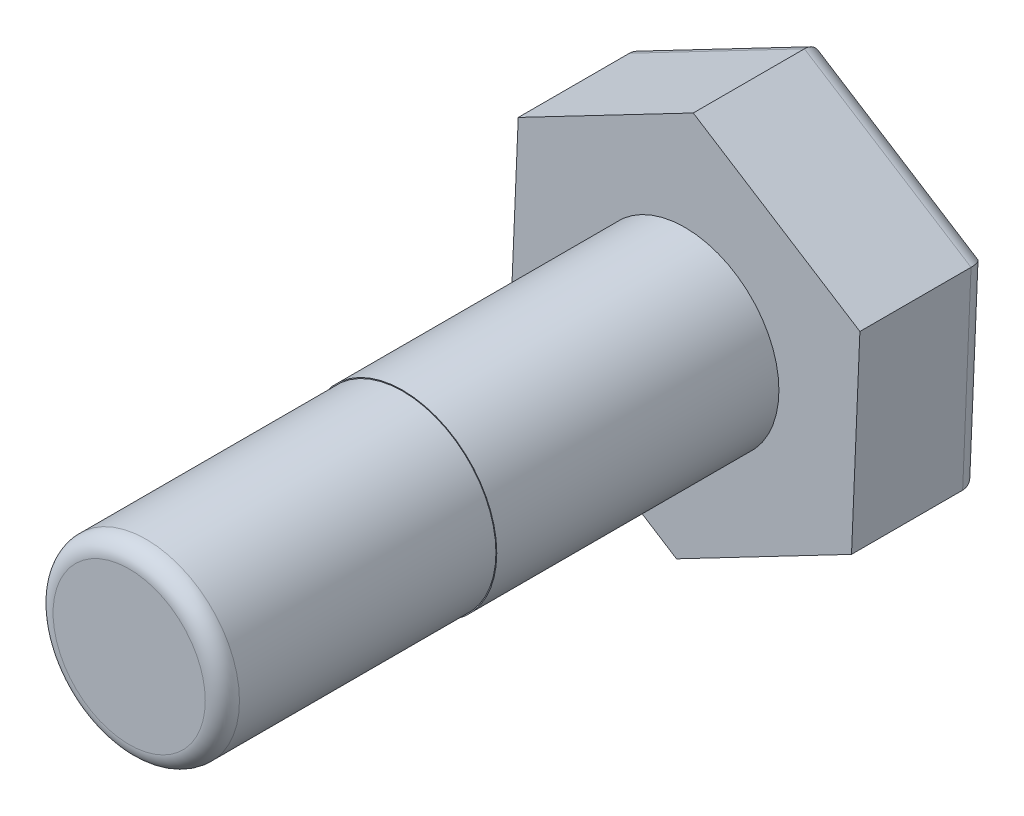
ISO-10303-21;
HEADER;
FILE_DESCRIPTION(('STEP AP214'),'2;1');
FILE_NAME('part.step','',(''),(''),'','','');
FILE_SCHEMA(('AUTOMOTIVE_DESIGN { 1 0 10303 214 1 1 1 1 }'));
ENDSEC;
DATA;
#1=APPLICATION_CONTEXT('core data for automotive mechanical design processes');
#2=APPLICATION_PROTOCOL_DEFINITION('international standard','automotive_design',2000,#1);
#3=PRODUCT_CONTEXT('',#1,'mechanical');
#4=PRODUCT('Part','Part','',(#3));
#5=PRODUCT_RELATED_PRODUCT_CATEGORY('part','',(#4));
#6=PRODUCT_DEFINITION_FORMATION('','',#4);
#7=PRODUCT_DEFINITION_CONTEXT('part definition',#1,'design');
#8=PRODUCT_DEFINITION('design','',#6,#7);
#9=PRODUCT_DEFINITION_SHAPE('','',#8);
#10=(LENGTH_UNIT() NAMED_UNIT(*) SI_UNIT(.MILLI.,.METRE.));
#11=(NAMED_UNIT(*) PLANE_ANGLE_UNIT() SI_UNIT($,.RADIAN.));
#12=(NAMED_UNIT(*) SI_UNIT($,.STERADIAN.) SOLID_ANGLE_UNIT());
#13=UNCERTAINTY_MEASURE_WITH_UNIT(LENGTH_MEASURE(1.E-05),#10,'distance_accuracy_value','');
#14=(GEOMETRIC_REPRESENTATION_CONTEXT(3) GLOBAL_UNCERTAINTY_ASSIGNED_CONTEXT((#13)) GLOBAL_UNIT_ASSIGNED_CONTEXT((#10,
#11,#12)) REPRESENTATION_CONTEXT('',''));
#15=CARTESIAN_POINT('',(0.,0.,0.));
#16=DIRECTION('',(0.,0.,1.));
#17=DIRECTION('',(1.,0.,0.));
#18=AXIS2_PLACEMENT_3D('',#15,#16,#17);
#19=CARTESIAN_POINT('',(0.,0.,48.));
#20=DIRECTION('',(0.,0.,1.));
#21=DIRECTION('',(1.,0.,0.));
#22=AXIS2_PLACEMENT_3D('',#19,#20,#21);
#23=PLANE('',#22);
#24=CARTESIAN_POINT('',(0.,0.,48.));
#25=DIRECTION('',(0.,0.,1.));
#26=DIRECTION('',(1.,0.,0.));
#27=AXIS2_PLACEMENT_3D('',#24,#25,#26);
#28=CIRCLE('',#27,11.);
#29=CARTESIAN_POINT('',(11.,0.,48.));
#30=VERTEX_POINT('',#29);
#31=EDGE_CURVE('E130',#30,#30,#28,.T.);
#32=ORIENTED_EDGE('',*,*,#31,.T.);
#33=EDGE_LOOP('',(#32));
#34=FACE_BOUND('',#33,.T.);
#35=CARTESIAN_POINT('',(0.,0.,48.));
#36=DIRECTION('',(0.,0.,1.));
#37=DIRECTION('',(1.,0.,0.));
#38=AXIS2_PLACEMENT_3D('',#35,#36,#37);
#39=CIRCLE('',#38,10.9);
#40=CARTESIAN_POINT('',(10.9,0.,48.));
#41=VERTEX_POINT('',#40);
#42=EDGE_CURVE('E165',#41,#41,#39,.T.);
#43=ORIENTED_EDGE('',*,*,#42,.F.);
#44=EDGE_LOOP('',(#43));
#45=FACE_BOUND('',#44,.T.);
#46=ADVANCED_FACE('F36',(#34,#45),#23,.T.);
#47=CARTESIAN_POINT('',(21.4532721099387,33.7602890357432,15.));
#48=DIRECTION('',(0.,0.,1.));
#49=DIRECTION('',(1.,0.,0.));
#50=AXIS2_PLACEMENT_3D('',#47,#48,#49);
#51=PLANE('',#50);
#52=DIRECTION('',(0.0424733530908878,0.999097599975707,0.));
#53=VECTOR('',#52,1.);
#54=CARTESIAN_POINT('',(19.4915119627059,-12.3860524276714,15.));
#55=LINE('',#54,#53);
#56=CARTESIAN_POINT('',(19.4915119627059,-12.3860524276714,15.));
#57=VERTEX_POINT('',#56);
#58=CARTESIAN_POINT('',(20.4723920363223,10.6871183040359,15.));
#59=VERTEX_POINT('',#58);
#60=EDGE_CURVE('E122',#57,#59,#55,.T.);
#61=ORIENTED_EDGE('',*,*,#60,.T.);
#62=DIRECTION('',(-0.844007225893581,0.536331802748468,0.));
#63=VECTOR('',#62,1.);
#64=CARTESIAN_POINT('',(20.4723920363223,10.6871183040359,15.));
#65=LINE('',#64,#63);
#66=CARTESIAN_POINT('',(0.980880073616411,23.0731707317073,15.));
#67=VERTEX_POINT('',#66);
#68=EDGE_CURVE('E110',#59,#67,#65,.T.);
#69=ORIENTED_EDGE('',*,*,#68,.T.);
#70=DIRECTION('',(-0.886480578984469,-0.462765797227238,0.));
#71=VECTOR('',#70,1.);
#72=CARTESIAN_POINT('',(0.980880073616411,23.0731707317073,15.));
#73=LINE('',#72,#71);
#74=CARTESIAN_POINT('',(-19.4915119627059,12.3860524276714,15.));
#75=VERTEX_POINT('',#74);
#76=EDGE_CURVE('E121',#67,#75,#73,.T.);
#77=ORIENTED_EDGE('',*,*,#76,.T.);
#78=DIRECTION('',(-0.0424733530908877,-0.999097599975707,0.));
#79=VECTOR('',#78,1.);
#80=CARTESIAN_POINT('',(-19.4915119627059,12.3860524276714,15.));
#81=LINE('',#80,#79);
#82=CARTESIAN_POINT('',(-20.4723920363223,-10.6871183040359,15.));
#83=VERTEX_POINT('',#82);
#84=EDGE_CURVE('E270',#75,#83,#81,.T.);
#85=ORIENTED_EDGE('',*,*,#84,.T.);
#86=DIRECTION('',(0.844007225893581,-0.536331802748469,0.));
#87=VECTOR('',#86,1.);
#88=CARTESIAN_POINT('',(-20.4723920363223,-10.6871183040359,15.));
#89=LINE('',#88,#87);
#90=CARTESIAN_POINT('',(-0.980880073616402,-23.0731707317073,15.));
#91=VERTEX_POINT('',#90);
#92=EDGE_CURVE('E272',#83,#91,#89,.T.);
#93=ORIENTED_EDGE('',*,*,#92,.T.);
#94=DIRECTION('',(0.886480578984469,0.462765797227238,0.));
#95=VECTOR('',#94,1.);
#96=CARTESIAN_POINT('',(-0.980880073616402,-23.0731707317073,15.));
#97=LINE('',#96,#95);
#98=EDGE_CURVE('E128',#91,#57,#97,.T.);
#99=ORIENTED_EDGE('',*,*,#98,.T.);
#100=EDGE_LOOP('',(#61,#69,#77,#85,#93,#99));
#101=FACE_BOUND('',#100,.T.);
#102=CARTESIAN_POINT('',(0.,0.,15.));
#103=DIRECTION('',(0.,0.,1.));
#104=DIRECTION('',(1.,0.,0.));
#105=AXIS2_PLACEMENT_3D('',#102,#103,#104);
#106=CIRCLE('',#105,11.);
#107=CARTESIAN_POINT('',(11.,0.,15.));
#108=VERTEX_POINT('',#107);
#109=EDGE_CURVE('E178',#108,#108,#106,.T.);
#110=ORIENTED_EDGE('',*,*,#109,.F.);
#111=EDGE_LOOP('',(#110));
#112=FACE_BOUND('',#111,.T.);
#113=ADVANCED_FACE('F125',(#101,#112),#51,.T.);
#114=CARTESIAN_POINT('',(19.4915119627059,-12.3860524276714,15.));
#115=DIRECTION('',(-0.999097599975706,0.0424733530908878,0.));
#116=DIRECTION('',(-0.0424733530908878,-0.999097599975706,0.));
#117=AXIS2_PLACEMENT_3D('',#114,#115,#116);
#118=PLANE('',#117);
#119=DIRECTION('',(0.,0.,-1.));
#120=VECTOR('',#119,1.);
#121=CARTESIAN_POINT('',(19.4915119627059,-12.3860524276714,15.));
#122=LINE('',#121,#120);
#123=CARTESIAN_POINT('',(19.4915119627059,-12.3860524276714,2.));
#124=VERTEX_POINT('',#123);
#125=EDGE_CURVE('E277',#57,#124,#122,.T.);
#126=ORIENTED_EDGE('',*,*,#125,.T.);
#127=DIRECTION('',(0.0424733530908878,0.999097599975706,0.));
#128=VECTOR('',#127,1.);
#129=CARTESIAN_POINT('',(19.4915119627059,-12.3860524276714,2.));
#130=LINE('',#129,#128);
#131=CARTESIAN_POINT('',(20.4723920363223,10.6871183040359,2.));
#132=VERTEX_POINT('',#131);
#133=EDGE_CURVE('E134',#124,#132,#130,.T.);
#134=ORIENTED_EDGE('',*,*,#133,.T.);
#135=DIRECTION('',(0.,0.,-1.));
#136=VECTOR('',#135,1.);
#137=CARTESIAN_POINT('',(20.4723920363223,10.6871183040359,15.));
#138=LINE('',#137,#136);
#139=EDGE_CURVE('E115',#59,#132,#138,.T.);
#140=ORIENTED_EDGE('',*,*,#139,.F.);
#141=ORIENTED_EDGE('',*,*,#60,.F.);
#142=EDGE_LOOP('',(#126,#134,#140,#141));
#143=FACE_BOUND('',#142,.T.);
#144=ADVANCED_FACE('F132',(#143),#118,.F.);
#145=CARTESIAN_POINT('',(20.4723920363223,10.6871183040359,15.));
#146=DIRECTION('',(-0.536331802748468,-0.844007225893581,0.));
#147=DIRECTION('',(0.844007225893581,-0.536331802748468,0.));
#148=AXIS2_PLACEMENT_3D('',#145,#146,#147);
#149=PLANE('',#148);
#150=ORIENTED_EDGE('',*,*,#139,.T.);
#151=DIRECTION('',(-0.844007225893581,0.536331802748468,0.));
#152=VECTOR('',#151,1.);
#153=CARTESIAN_POINT('',(20.4723920363223,10.6871183040359,2.));
#154=LINE('',#153,#152);
#155=CARTESIAN_POINT('',(0.980880073616411,23.0731707317073,2.));
#156=VERTEX_POINT('',#155);
#157=EDGE_CURVE('E135',#132,#156,#154,.T.);
#158=ORIENTED_EDGE('',*,*,#157,.T.);
#159=DIRECTION('',(0.,0.,-1.));
#160=VECTOR('',#159,1.);
#161=CARTESIAN_POINT('',(0.980880073616411,23.0731707317073,15.));
#162=LINE('',#161,#160);
#163=EDGE_CURVE('E118',#67,#156,#162,.T.);
#164=ORIENTED_EDGE('',*,*,#163,.F.);
#165=ORIENTED_EDGE('',*,*,#68,.F.);
#166=EDGE_LOOP('',(#150,#158,#164,#165));
#167=FACE_BOUND('',#166,.T.);
#168=ADVANCED_FACE('F112',(#167),#149,.F.);
#169=CARTESIAN_POINT('',(0.980880073616411,23.0731707317073,15.));
#170=DIRECTION('',(0.462765797227238,-0.886480578984469,0.));
#171=DIRECTION('',(0.886480578984469,0.462765797227238,0.));
#172=AXIS2_PLACEMENT_3D('',#169,#170,#171);
#173=PLANE('',#172);
#174=ORIENTED_EDGE('',*,*,#163,.T.);
#175=DIRECTION('',(-0.886480578984469,-0.462765797227238,0.));
#176=VECTOR('',#175,1.);
#177=CARTESIAN_POINT('',(0.980880073616411,23.0731707317073,2.));
#178=LINE('',#177,#176);
#179=CARTESIAN_POINT('',(-19.4915119627059,12.3860524276714,2.));
#180=VERTEX_POINT('',#179);
#181=EDGE_CURVE('E155',#156,#180,#178,.T.);
#182=ORIENTED_EDGE('',*,*,#181,.T.);
#183=DIRECTION('',(0.,0.,-1.));
#184=VECTOR('',#183,1.);
#185=CARTESIAN_POINT('',(-19.4915119627059,12.3860524276714,15.));
#186=LINE('',#185,#184);
#187=EDGE_CURVE('E139',#75,#180,#186,.T.);
#188=ORIENTED_EDGE('',*,*,#187,.F.);
#189=ORIENTED_EDGE('',*,*,#76,.F.);
#190=EDGE_LOOP('',(#174,#182,#188,#189));
#191=FACE_BOUND('',#190,.T.);
#192=ADVANCED_FACE('F221',(#191),#173,.F.);
#193=CARTESIAN_POINT('',(-19.4915119627059,12.3860524276714,15.));
#194=DIRECTION('',(0.999097599975706,-0.0424733530908877,0.));
#195=DIRECTION('',(0.0424733530908877,0.999097599975706,0.));
#196=AXIS2_PLACEMENT_3D('',#193,#194,#195);
#197=PLANE('',#196);
#198=ORIENTED_EDGE('',*,*,#187,.T.);
#199=DIRECTION('',(-0.0424733530908877,-0.999097599975706,0.));
#200=VECTOR('',#199,1.);
#201=CARTESIAN_POINT('',(-19.4915119627059,12.3860524276714,2.));
#202=LINE('',#201,#200);
#203=CARTESIAN_POINT('',(-20.4723920363223,-10.6871183040359,2.));
#204=VERTEX_POINT('',#203);
#205=EDGE_CURVE('E157',#180,#204,#202,.T.);
#206=ORIENTED_EDGE('',*,*,#205,.T.);
#207=DIRECTION('',(0.,0.,-1.));
#208=VECTOR('',#207,1.);
#209=CARTESIAN_POINT('',(-20.4723920363223,-10.6871183040359,15.));
#210=LINE('',#209,#208);
#211=EDGE_CURVE('E281',#83,#204,#210,.T.);
#212=ORIENTED_EDGE('',*,*,#211,.F.);
#213=ORIENTED_EDGE('',*,*,#84,.F.);
#214=EDGE_LOOP('',(#198,#206,#212,#213));
#215=FACE_BOUND('',#214,.T.);
#216=ADVANCED_FACE('F218',(#215),#197,.F.);
#217=CARTESIAN_POINT('',(-20.4723920363223,-10.6871183040359,15.));
#218=DIRECTION('',(0.536331802748468,0.844007225893581,0.));
#219=DIRECTION('',(-0.844007225893581,0.536331802748468,0.));
#220=AXIS2_PLACEMENT_3D('',#217,#218,#219);
#221=PLANE('',#220);
#222=ORIENTED_EDGE('',*,*,#211,.T.);
#223=DIRECTION('',(0.844007225893581,-0.536331802748468,0.));
#224=VECTOR('',#223,1.);
#225=CARTESIAN_POINT('',(-20.4723920363223,-10.6871183040359,2.));
#226=LINE('',#225,#224);
#227=CARTESIAN_POINT('',(-0.980880073616402,-23.0731707317073,2.));
#228=VERTEX_POINT('',#227);
#229=EDGE_CURVE('E59',#204,#228,#226,.T.);
#230=ORIENTED_EDGE('',*,*,#229,.T.);
#231=DIRECTION('',(0.,0.,-1.));
#232=VECTOR('',#231,1.);
#233=CARTESIAN_POINT('',(-0.980880073616402,-23.0731707317073,15.));
#234=LINE('',#233,#232);
#235=EDGE_CURVE('E279',#91,#228,#234,.T.);
#236=ORIENTED_EDGE('',*,*,#235,.F.);
#237=ORIENTED_EDGE('',*,*,#92,.F.);
#238=EDGE_LOOP('',(#222,#230,#236,#237));
#239=FACE_BOUND('',#238,.T.);
#240=ADVANCED_FACE('F215',(#239),#221,.F.);
#241=CARTESIAN_POINT('',(-0.980880073616402,-23.0731707317073,15.));
#242=DIRECTION('',(-0.462765797227238,0.886480578984469,0.));
#243=DIRECTION('',(-0.886480578984469,-0.462765797227238,0.));
#244=AXIS2_PLACEMENT_3D('',#241,#242,#243);
#245=PLANE('',#244);
#246=ORIENTED_EDGE('',*,*,#235,.T.);
#247=DIRECTION('',(0.886480578984469,0.462765797227238,0.));
#248=VECTOR('',#247,1.);
#249=CARTESIAN_POINT('',(-0.980880073616402,-23.0731707317073,2.));
#250=LINE('',#249,#248);
#251=EDGE_CURVE('E51',#228,#124,#250,.T.);
#252=ORIENTED_EDGE('',*,*,#251,.T.);
#253=ORIENTED_EDGE('',*,*,#125,.F.);
#254=ORIENTED_EDGE('',*,*,#98,.F.);
#255=EDGE_LOOP('',(#246,#252,#253,#254));
#256=FACE_BOUND('',#255,.T.);
#257=ADVANCED_FACE('F211',(#256),#245,.F.);
#258=CARTESIAN_POINT('',(21.4532721099387,33.7602890357432,0.));
#259=DIRECTION('',(0.,0.,1.));
#260=DIRECTION('',(1.,0.,0.));
#261=AXIS2_PLACEMENT_3D('',#258,#259,#260);
#262=PLANE('',#261);
#263=DIRECTION('',(-0.886480578984469,-0.462765797227238,0.));
#264=VECTOR('',#263,1.);
#265=CARTESIAN_POINT('',(22.3788037043932,31.9873278777743,0.));
#266=LINE('',#265,#264);
#267=CARTESIAN_POINT('',(-17.5423607664353,11.1474471849043,0.));
#268=VERTEX_POINT('',#267);
#269=CARTESIAN_POINT('',(0.882792066254768,20.7658536585366,0.));
#270=VERTEX_POINT('',#269);
#271=EDGE_CURVE('E150',#268,#270,#266,.F.);
#272=ORIENTED_EDGE('',*,*,#271,.T.);
#273=DIRECTION('',(-0.844007225893581,0.536331802748468,0.));
#274=VECTOR('',#273,1.);
#275=CARTESIAN_POINT('',(9.65397244947244,15.1921300660844,0.));
#276=LINE('',#275,#274);
#277=CARTESIAN_POINT('',(18.4251528326901,9.61840647363232,0.));
#278=VERTEX_POINT('',#277);
#279=EDGE_CURVE('E152',#270,#278,#276,.F.);
#280=ORIENTED_EDGE('',*,*,#279,.T.);
#281=DIRECTION('',(0.0424733530908878,0.999097599975706,0.));
#282=VECTOR('',#281,1.);
#283=CARTESIAN_POINT('',(19.4550769099873,33.845235741925,0.));
#284=LINE('',#283,#282);
#285=CARTESIAN_POINT('',(17.5423607664353,-11.1474471849043,0.));
#286=VERTEX_POINT('',#285);
#287=EDGE_CURVE('E137',#278,#286,#284,.F.);
#288=ORIENTED_EDGE('',*,*,#287,.T.);
#289=DIRECTION('',(0.886480578984469,0.462765797227238,0.));
#290=VECTOR('',#289,1.);
#291=CARTESIAN_POINT('',(39.0383724045738,0.0740270343334015,0.));
#292=LINE('',#291,#290);
#293=CARTESIAN_POINT('',(-0.882792066254761,-20.7658536585366,0.));
#294=VERTEX_POINT('',#293);
#295=EDGE_CURVE('E144',#286,#294,#292,.F.);
#296=ORIENTED_EDGE('',*,*,#295,.T.);
#297=DIRECTION('',(0.844007225893581,-0.536331802748468,0.));
#298=VECTOR('',#297,1.);
#299=CARTESIAN_POINT('',(-9.65397244947243,-15.1921300660844,0.));
#300=LINE('',#299,#298);
#301=CARTESIAN_POINT('',(-18.4251528326901,-9.61840647363232,0.));
#302=VERTEX_POINT('',#301);
#303=EDGE_CURVE('E146',#294,#302,#300,.F.);
#304=ORIENTED_EDGE('',*,*,#303,.T.);
#305=DIRECTION('',(-0.0424733530908877,-0.999097599975706,0.));
#306=VECTOR('',#305,1.);
#307=CARTESIAN_POINT('',(-16.5124366891381,35.374276453197,0.));
#308=LINE('',#307,#306);
#309=EDGE_CURVE('E148',#302,#268,#308,.F.);
#310=ORIENTED_EDGE('',*,*,#309,.T.);
#311=EDGE_LOOP('',(#272,#280,#288,#296,#304,#310));
#312=FACE_BOUND('',#311,.T.);
#313=ADVANCED_FACE('F206',(#312),#262,.F.);
#314=CARTESIAN_POINT('',(0.,0.,48.));
#315=DIRECTION('',(0.,0.,-1.));
#316=DIRECTION('',(-1.,0.,0.));
#317=AXIS2_PLACEMENT_3D('',#314,#315,#316);
#318=CYLINDRICAL_SURFACE('',#317,11.);
#319=ORIENTED_EDGE('',*,*,#31,.F.);
#320=EDGE_LOOP('',(#319));
#321=FACE_BOUND('',#320,.T.);
#322=ORIENTED_EDGE('',*,*,#109,.T.);
#323=EDGE_LOOP('',(#322));
#324=FACE_BOUND('',#323,.T.);
#325=ADVANCED_FACE('F203',(#321,#324),#318,.T.);
#326=CARTESIAN_POINT('',(-19.3997284308254,-8.99910385224874,2.));
#327=DIRECTION('',(0.844007225893581,-0.536331802748468,0.));
#328=DIRECTION('',(0.536331802748468,0.844007225893581,0.));
#329=AXIS2_PLACEMENT_3D('',#326,#327,#328);
#330=CYLINDRICAL_SURFACE('',#329,2.);
#331=CARTESIAN_POINT('',(-18.4251528326901,-9.61840647363232,2.));
#332=DIRECTION('',(0.462765797227238,-0.886480578984469,0.));
#333=DIRECTION('',(0.886480578984469,0.462765797227238,0.));
#334=AXIS2_PLACEMENT_3D('',#331,#332,#333);
#335=ELLIPSE('',#334,2.3094010767585,2.);
#336=EDGE_CURVE('E173',#302,#204,#335,.F.);
#337=ORIENTED_EDGE('',*,*,#336,.F.);
#338=ORIENTED_EDGE('',*,*,#303,.F.);
#339=CARTESIAN_POINT('',(-0.882792066254761,-20.7658536585366,2.));
#340=DIRECTION('',(0.999097599975706,-0.042473353090888,0.));
#341=DIRECTION('',(0.042473353090888,0.999097599975707,0.));
#342=AXIS2_PLACEMENT_3D('',#339,#340,#341);
#343=ELLIPSE('',#342,2.3094010767585,2.);
#344=EDGE_CURVE('E176',#228,#294,#343,.T.);
#345=ORIENTED_EDGE('',*,*,#344,.F.);
#346=ORIENTED_EDGE('',*,*,#229,.F.);
#347=EDGE_LOOP('',(#337,#338,#345,#346));
#348=FACE_BOUND('',#347,.T.);
#349=ADVANCED_FACE('F205',(#348),#330,.T.);
#350=CARTESIAN_POINT('',(-1.90641166807088,-21.3002095737384,2.));
#351=DIRECTION('',(0.886480578984469,0.462765797227238,0.));
#352=DIRECTION('',(-0.462765797227238,0.886480578984469,0.));
#353=AXIS2_PLACEMENT_3D('',#350,#351,#352);
#354=CYLINDRICAL_SURFACE('',#353,2.);
#355=ORIENTED_EDGE('',*,*,#344,.T.);
#356=ORIENTED_EDGE('',*,*,#295,.F.);
#357=CARTESIAN_POINT('',(17.5423607664353,-11.1474471849043,2.));
#358=DIRECTION('',(0.536331802748468,0.844007225893581,0.));
#359=DIRECTION('',(-0.844007225893581,0.536331802748469,0.));
#360=AXIS2_PLACEMENT_3D('',#357,#358,#359);
#361=ELLIPSE('',#360,2.3094010767585,2.);
#362=EDGE_CURVE('E170',#124,#286,#361,.T.);
#363=ORIENTED_EDGE('',*,*,#362,.F.);
#364=ORIENTED_EDGE('',*,*,#251,.F.);
#365=EDGE_LOOP('',(#355,#356,#363,#364));
#366=FACE_BOUND('',#365,.T.);
#367=ADVANCED_FACE('F245',(#366),#354,.T.);
#368=CARTESIAN_POINT('',(-17.4933167627545,12.3011057214896,2.));
#369=DIRECTION('',(-0.0424733530908877,-0.999097599975706,0.));
#370=DIRECTION('',(0.999097599975706,-0.0424733530908877,0.));
#371=AXIS2_PLACEMENT_3D('',#368,#369,#370);
#372=CYLINDRICAL_SURFACE('',#371,2.);
#373=ORIENTED_EDGE('',*,*,#336,.T.);
#374=ORIENTED_EDGE('',*,*,#205,.F.);
#375=CARTESIAN_POINT('',(-17.5423607664353,11.1474471849043,2.));
#376=DIRECTION('',(-0.536331802748468,-0.844007225893581,0.));
#377=DIRECTION('',(0.844007225893581,-0.536331802748468,0.));
#378=AXIS2_PLACEMENT_3D('',#375,#376,#377);
#379=ELLIPSE('',#378,2.3094010767585,2.);
#380=EDGE_CURVE('E167',#268,#180,#379,.F.);
#381=ORIENTED_EDGE('',*,*,#380,.F.);
#382=ORIENTED_EDGE('',*,*,#309,.F.);
#383=EDGE_LOOP('',(#373,#374,#381,#382));
#384=FACE_BOUND('',#383,.T.);
#385=ADVANCED_FACE('F241',(#384),#372,.T.);
#386=CARTESIAN_POINT('',(17.4933167627545,-12.3011057214897,2.));
#387=DIRECTION('',(0.0424733530908878,0.999097599975706,0.));
#388=DIRECTION('',(-0.999097599975706,0.0424733530908878,0.));
#389=AXIS2_PLACEMENT_3D('',#386,#387,#388);
#390=CYLINDRICAL_SURFACE('',#389,2.);
#391=ORIENTED_EDGE('',*,*,#362,.T.);
#392=ORIENTED_EDGE('',*,*,#287,.F.);
#393=CARTESIAN_POINT('',(18.4251528326901,9.61840647363231,2.));
#394=DIRECTION('',(-0.462765797227238,0.886480578984469,0.));
#395=DIRECTION('',(0.886480578984469,0.462765797227238,0.));
#396=AXIS2_PLACEMENT_3D('',#393,#394,#395);
#397=ELLIPSE('',#396,2.3094010767585,2.);
#398=EDGE_CURVE('E164',#132,#278,#397,.T.);
#399=ORIENTED_EDGE('',*,*,#398,.F.);
#400=ORIENTED_EDGE('',*,*,#133,.F.);
#401=EDGE_LOOP('',(#391,#392,#399,#400));
#402=FACE_BOUND('',#401,.T.);
#403=ADVANCED_FACE('F237',(#402),#390,.T.);
#404=CARTESIAN_POINT('',(1.90641166807089,21.3002095737384,2.));
#405=DIRECTION('',(-0.886480578984469,-0.462765797227238,0.));
#406=DIRECTION('',(0.462765797227238,-0.886480578984469,0.));
#407=AXIS2_PLACEMENT_3D('',#404,#405,#406);
#408=CYLINDRICAL_SURFACE('',#407,2.);
#409=ORIENTED_EDGE('',*,*,#380,.T.);
#410=ORIENTED_EDGE('',*,*,#181,.F.);
#411=CARTESIAN_POINT('',(0.882792066254761,20.7658536585366,2.));
#412=DIRECTION('',(-0.999097599975706,0.042473353090888,0.));
#413=DIRECTION('',(-0.0424733530908879,-0.999097599975706,0.));
#414=AXIS2_PLACEMENT_3D('',#411,#412,#413);
#415=ELLIPSE('',#414,2.3094010767585,2.);
#416=EDGE_CURVE('E162',#270,#156,#415,.F.);
#417=ORIENTED_EDGE('',*,*,#416,.F.);
#418=ORIENTED_EDGE('',*,*,#271,.F.);
#419=EDGE_LOOP('',(#409,#410,#417,#418));
#420=FACE_BOUND('',#419,.T.);
#421=ADVANCED_FACE('F233',(#420),#408,.T.);
#422=CARTESIAN_POINT('',(19.3997284308254,8.99910385224875,2.));
#423=DIRECTION('',(-0.844007225893581,0.536331802748468,0.));
#424=DIRECTION('',(-0.536331802748468,-0.844007225893581,0.));
#425=AXIS2_PLACEMENT_3D('',#422,#423,#424);
#426=CYLINDRICAL_SURFACE('',#425,2.);
#427=ORIENTED_EDGE('',*,*,#398,.T.);
#428=ORIENTED_EDGE('',*,*,#279,.F.);
#429=ORIENTED_EDGE('',*,*,#416,.T.);
#430=ORIENTED_EDGE('',*,*,#157,.F.);
#431=EDGE_LOOP('',(#427,#428,#429,#430));
#432=FACE_BOUND('',#431,.T.);
#433=ADVANCED_FACE('F230',(#432),#426,.T.);
#434=CARTESIAN_POINT('',(0.,0.,80.));
#435=DIRECTION('',(0.,0.,-1.));
#436=DIRECTION('',(-1.,0.,0.));
#437=AXIS2_PLACEMENT_3D('',#434,#435,#436);
#438=CYLINDRICAL_SURFACE('',#437,10.9);
#439=CARTESIAN_POINT('',(0.,0.,78.));
#440=DIRECTION('',(0.,0.,1.));
#441=DIRECTION('',(1.,0.,0.));
#442=AXIS2_PLACEMENT_3D('',#439,#440,#441);
#443=CIRCLE('',#442,10.9);
#444=CARTESIAN_POINT('',(10.9,0.,78.));
#445=VERTEX_POINT('',#444);
#446=EDGE_CURVE('E11',#445,#445,#443,.F.);
#447=ORIENTED_EDGE('',*,*,#446,.T.);
#448=EDGE_LOOP('',(#447));
#449=FACE_BOUND('',#448,.T.);
#450=ORIENTED_EDGE('',*,*,#42,.T.);
#451=EDGE_LOOP('',(#450));
#452=FACE_BOUND('',#451,.T.);
#453=ADVANCED_FACE('F189',(#449,#452),#438,.T.);
#454=CARTESIAN_POINT('',(0.,0.,80.));
#455=DIRECTION('',(0.,0.,1.));
#456=DIRECTION('',(1.,0.,0.));
#457=AXIS2_PLACEMENT_3D('',#454,#455,#456);
#458=PLANE('',#457);
#459=CARTESIAN_POINT('',(0.,0.,80.));
#460=DIRECTION('',(0.,0.,1.));
#461=DIRECTION('',(1.,0.,0.));
#462=AXIS2_PLACEMENT_3D('',#459,#460,#461);
#463=CIRCLE('',#462,8.9);
#464=CARTESIAN_POINT('',(8.9,0.,80.));
#465=VERTEX_POINT('',#464);
#466=EDGE_CURVE('E44',#465,#465,#463,.T.);
#467=ORIENTED_EDGE('',*,*,#466,.T.);
#468=EDGE_LOOP('',(#467));
#469=FACE_BOUND('',#468,.T.);
#470=ADVANCED_FACE('F182',(#469),#458,.T.);
#471=CARTESIAN_POINT('',(0.,0.,78.));
#472=DIRECTION('',(0.,0.,1.));
#473=DIRECTION('',(1.,0.,0.));
#474=AXIS2_PLACEMENT_3D('',#471,#472,#473);
#475=TOROIDAL_SURFACE('',#474,8.9,2.);
#476=ORIENTED_EDGE('',*,*,#446,.F.);
#477=EDGE_LOOP('',(#476));
#478=FACE_BOUND('',#477,.T.);
#479=ORIENTED_EDGE('',*,*,#466,.F.);
#480=EDGE_LOOP('',(#479));
#481=FACE_BOUND('',#480,.T.);
#482=ADVANCED_FACE('F38',(#478,#481),#475,.T.);
#483=CLOSED_SHELL('',(#46,#113,#144,#168,#192,#216,#240,#257,#313,#325,#349,#367,#385,#403,#421,
#433,#453,#470,#482));
#484=MANIFOLD_SOLID_BREP('B2',#483);
#485=ADVANCED_BREP_SHAPE_REPRESENTATION('',(#18,#484),#14);
#486=SHAPE_DEFINITION_REPRESENTATION(#9,#485);
ENDSEC;
END-ISO-10303-21;
